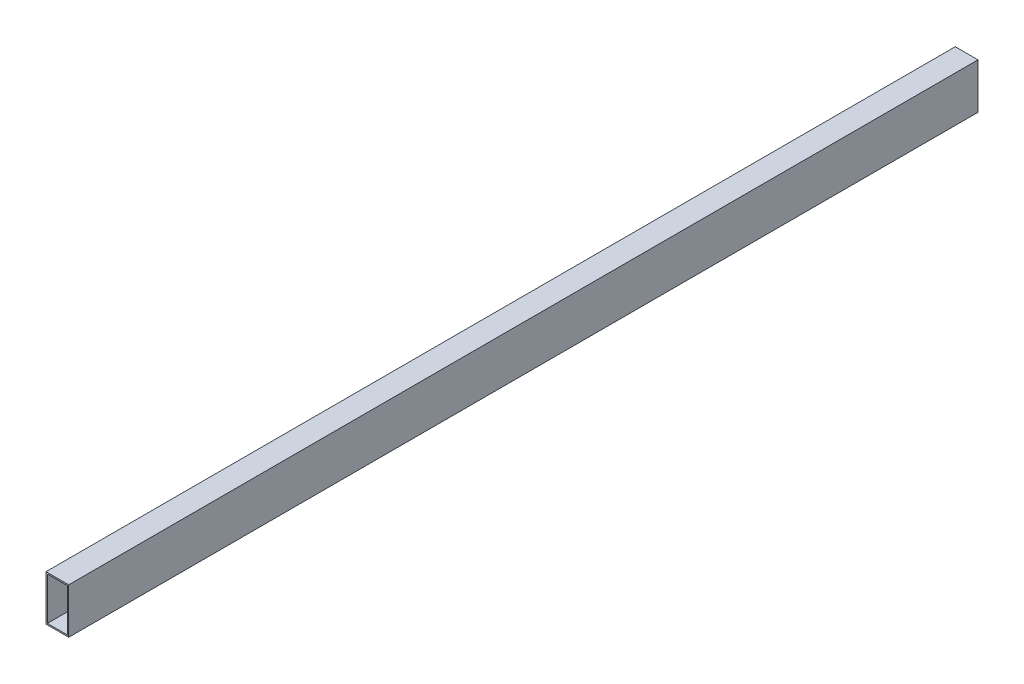
ISO-10303-21;
HEADER;
FILE_DESCRIPTION(('STEP AP214'),'2;1');
FILE_NAME('part.step','',(''),(''),'','','');
FILE_SCHEMA(('AUTOMOTIVE_DESIGN { 1 0 10303 214 1 1 1 1 }'));
ENDSEC;
DATA;
#1=APPLICATION_CONTEXT('core data for automotive mechanical design processes');
#2=APPLICATION_PROTOCOL_DEFINITION('international standard','automotive_design',2000,#1);
#3=PRODUCT_CONTEXT('',#1,'mechanical');
#4=PRODUCT('Part','Part','',(#3));
#5=PRODUCT_RELATED_PRODUCT_CATEGORY('part','',(#4));
#6=PRODUCT_DEFINITION_FORMATION('','',#4);
#7=PRODUCT_DEFINITION_CONTEXT('part definition',#1,'design');
#8=PRODUCT_DEFINITION('design','',#6,#7);
#9=PRODUCT_DEFINITION_SHAPE('','',#8);
#10=(LENGTH_UNIT() NAMED_UNIT(*) SI_UNIT(.MILLI.,.METRE.));
#11=(NAMED_UNIT(*) PLANE_ANGLE_UNIT() SI_UNIT($,.RADIAN.));
#12=(NAMED_UNIT(*) SI_UNIT($,.STERADIAN.) SOLID_ANGLE_UNIT());
#13=UNCERTAINTY_MEASURE_WITH_UNIT(LENGTH_MEASURE(1.E-05),#10,'distance_accuracy_value','');
#14=(GEOMETRIC_REPRESENTATION_CONTEXT(3) GLOBAL_UNCERTAINTY_ASSIGNED_CONTEXT((#13)) GLOBAL_UNIT_ASSIGNED_CONTEXT((#10,
#11,#12)) REPRESENTATION_CONTEXT('',''));
#15=CARTESIAN_POINT('',(0.,0.,0.));
#16=DIRECTION('',(0.,0.,1.));
#17=DIRECTION('',(1.,0.,0.));
#18=AXIS2_PLACEMENT_3D('',#15,#16,#17);
#19=CARTESIAN_POINT('',(0.,0.,1016.));
#20=DIRECTION('',(0.,0.,1.));
#21=DIRECTION('',(1.,0.,0.));
#22=AXIS2_PLACEMENT_3D('',#19,#20,#21);
#23=PLANE('',#22);
#24=DIRECTION('',(0.,-1.,0.));
#25=VECTOR('',#24,1.);
#26=CARTESIAN_POINT('',(0.,0.,1016.));
#27=LINE('',#26,#25);
#28=CARTESIAN_POINT('',(0.,50.8,1016.));
#29=VERTEX_POINT('',#28);
#30=CARTESIAN_POINT('',(0.,0.,1016.));
#31=VERTEX_POINT('',#30);
#32=EDGE_CURVE('E177',#29,#31,#27,.T.);
#33=ORIENTED_EDGE('',*,*,#32,.T.);
#34=DIRECTION('',(1.,0.,0.));
#35=VECTOR('',#34,1.);
#36=CARTESIAN_POINT('',(0.,0.,1016.));
#37=LINE('',#36,#35);
#38=CARTESIAN_POINT('',(25.4,0.,1016.));
#39=VERTEX_POINT('',#38);
#40=EDGE_CURVE('E181',#31,#39,#37,.T.);
#41=ORIENTED_EDGE('',*,*,#40,.T.);
#42=DIRECTION('',(0.,1.,0.));
#43=VECTOR('',#42,1.);
#44=CARTESIAN_POINT('',(25.4,0.,1016.));
#45=LINE('',#44,#43);
#46=CARTESIAN_POINT('',(25.4,50.8,1016.));
#47=VERTEX_POINT('',#46);
#48=EDGE_CURVE('E185',#39,#47,#45,.T.);
#49=ORIENTED_EDGE('',*,*,#48,.T.);
#50=DIRECTION('',(-1.,0.,0.));
#51=VECTOR('',#50,1.);
#52=CARTESIAN_POINT('',(0.,50.8,1016.));
#53=LINE('',#52,#51);
#54=EDGE_CURVE('E188',#47,#29,#53,.T.);
#55=ORIENTED_EDGE('',*,*,#54,.T.);
#56=EDGE_LOOP('',(#33,#41,#49,#55));
#57=FACE_BOUND('',#56,.T.);
#58=DIRECTION('',(1.,0.,0.));
#59=VECTOR('',#58,1.);
#60=CARTESIAN_POINT('',(0.,1.524,1016.));
#61=LINE('',#60,#59);
#62=CARTESIAN_POINT('',(1.524,1.524,1016.));
#63=VERTEX_POINT('',#62);
#64=CARTESIAN_POINT('',(23.876,1.524,1016.));
#65=VERTEX_POINT('',#64);
#66=EDGE_CURVE('E138',#63,#65,#61,.T.);
#67=ORIENTED_EDGE('',*,*,#66,.F.);
#68=DIRECTION('',(0.,-1.,0.));
#69=VECTOR('',#68,1.);
#70=CARTESIAN_POINT('',(1.524,0.,1016.));
#71=LINE('',#70,#69);
#72=CARTESIAN_POINT('',(1.52399999999999,49.276,1016.));
#73=VERTEX_POINT('',#72);
#74=EDGE_CURVE('E129',#73,#63,#71,.T.);
#75=ORIENTED_EDGE('',*,*,#74,.F.);
#76=DIRECTION('',(-1.,0.,0.));
#77=VECTOR('',#76,1.);
#78=CARTESIAN_POINT('',(0.,49.276,1016.));
#79=LINE('',#78,#77);
#80=CARTESIAN_POINT('',(23.876,49.276,1016.));
#81=VERTEX_POINT('',#80);
#82=EDGE_CURVE('E155',#81,#73,#79,.T.);
#83=ORIENTED_EDGE('',*,*,#82,.F.);
#84=DIRECTION('',(0.,1.,0.));
#85=VECTOR('',#84,1.);
#86=CARTESIAN_POINT('',(23.876,0.,1016.));
#87=LINE('',#86,#85);
#88=EDGE_CURVE('E151',#65,#81,#87,.T.);
#89=ORIENTED_EDGE('',*,*,#88,.F.);
#90=EDGE_LOOP('',(#67,#75,#83,#89));
#91=FACE_BOUND('',#90,.T.);
#92=ADVANCED_FACE('F63',(#57,#91),#23,.T.);
#93=CARTESIAN_POINT('',(0.,0.,0.));
#94=DIRECTION('',(0.,0.,1.));
#95=DIRECTION('',(1.,0.,0.));
#96=AXIS2_PLACEMENT_3D('',#93,#94,#95);
#97=PLANE('',#96);
#98=DIRECTION('',(0.,-1.,0.));
#99=VECTOR('',#98,1.);
#100=CARTESIAN_POINT('',(0.,0.,0.));
#101=LINE('',#100,#99);
#102=CARTESIAN_POINT('',(0.,50.8,0.));
#103=VERTEX_POINT('',#102);
#104=CARTESIAN_POINT('',(0.,0.,0.));
#105=VERTEX_POINT('',#104);
#106=EDGE_CURVE('E147',#103,#105,#101,.T.);
#107=ORIENTED_EDGE('',*,*,#106,.F.);
#108=DIRECTION('',(-1.,0.,0.));
#109=VECTOR('',#108,1.);
#110=CARTESIAN_POINT('',(0.,50.8,0.));
#111=LINE('',#110,#109);
#112=CARTESIAN_POINT('',(25.4,50.8,0.));
#113=VERTEX_POINT('',#112);
#114=EDGE_CURVE('E182',#113,#103,#111,.T.);
#115=ORIENTED_EDGE('',*,*,#114,.F.);
#116=DIRECTION('',(0.,1.,0.));
#117=VECTOR('',#116,1.);
#118=CARTESIAN_POINT('',(25.4,0.,0.));
#119=LINE('',#118,#117);
#120=CARTESIAN_POINT('',(25.4,0.,0.));
#121=VERTEX_POINT('',#120);
#122=EDGE_CURVE('E198',#121,#113,#119,.T.);
#123=ORIENTED_EDGE('',*,*,#122,.F.);
#124=DIRECTION('',(1.,0.,0.));
#125=VECTOR('',#124,1.);
#126=CARTESIAN_POINT('',(0.,0.,0.));
#127=LINE('',#126,#125);
#128=EDGE_CURVE('E195',#105,#121,#127,.T.);
#129=ORIENTED_EDGE('',*,*,#128,.F.);
#130=EDGE_LOOP('',(#107,#115,#123,#129));
#131=FACE_BOUND('',#130,.T.);
#132=DIRECTION('',(0.,-1.,0.));
#133=VECTOR('',#132,1.);
#134=CARTESIAN_POINT('',(1.524,0.,0.));
#135=LINE('',#134,#133);
#136=CARTESIAN_POINT('',(1.52399999999999,49.276,0.));
#137=VERTEX_POINT('',#136);
#138=CARTESIAN_POINT('',(1.524,1.524,0.));
#139=VERTEX_POINT('',#138);
#140=EDGE_CURVE('E87',#137,#139,#135,.T.);
#141=ORIENTED_EDGE('',*,*,#140,.T.);
#142=DIRECTION('',(1.,0.,0.));
#143=VECTOR('',#142,1.);
#144=CARTESIAN_POINT('',(0.,1.524,0.));
#145=LINE('',#144,#143);
#146=CARTESIAN_POINT('',(23.876,1.524,0.));
#147=VERTEX_POINT('',#146);
#148=EDGE_CURVE('E145',#139,#147,#145,.T.);
#149=ORIENTED_EDGE('',*,*,#148,.T.);
#150=DIRECTION('',(0.,1.,0.));
#151=VECTOR('',#150,1.);
#152=CARTESIAN_POINT('',(23.876,0.,0.));
#153=LINE('',#152,#151);
#154=CARTESIAN_POINT('',(23.876,49.276,0.));
#155=VERTEX_POINT('',#154);
#156=EDGE_CURVE('E164',#147,#155,#153,.T.);
#157=ORIENTED_EDGE('',*,*,#156,.T.);
#158=DIRECTION('',(-1.,0.,0.));
#159=VECTOR('',#158,1.);
#160=CARTESIAN_POINT('',(0.,49.276,0.));
#161=LINE('',#160,#159);
#162=EDGE_CURVE('E139',#155,#137,#161,.T.);
#163=ORIENTED_EDGE('',*,*,#162,.T.);
#164=EDGE_LOOP('',(#141,#149,#157,#163));
#165=FACE_BOUND('',#164,.T.);
#166=ADVANCED_FACE('F221',(#131,#165),#97,.F.);
#167=CARTESIAN_POINT('',(0.,0.,1016.));
#168=DIRECTION('',(1.,0.,0.));
#169=DIRECTION('',(0.,1.,0.));
#170=AXIS2_PLACEMENT_3D('',#167,#168,#169);
#171=PLANE('',#170);
#172=ORIENTED_EDGE('',*,*,#106,.T.);
#173=DIRECTION('',(0.,0.,-1.));
#174=VECTOR('',#173,1.);
#175=CARTESIAN_POINT('',(0.,0.,1016.));
#176=LINE('',#175,#174);
#177=EDGE_CURVE('E12',#31,#105,#176,.T.);
#178=ORIENTED_EDGE('',*,*,#177,.F.);
#179=ORIENTED_EDGE('',*,*,#32,.F.);
#180=DIRECTION('',(0.,0.,-1.));
#181=VECTOR('',#180,1.);
#182=CARTESIAN_POINT('',(0.,50.8,1016.));
#183=LINE('',#182,#181);
#184=EDGE_CURVE('E191',#29,#103,#183,.T.);
#185=ORIENTED_EDGE('',*,*,#184,.T.);
#186=EDGE_LOOP('',(#172,#178,#179,#185));
#187=FACE_BOUND('',#186,.T.);
#188=ADVANCED_FACE('F65',(#187),#171,.F.);
#189=CARTESIAN_POINT('',(0.,0.,1016.));
#190=DIRECTION('',(0.,1.,0.));
#191=DIRECTION('',(0.,0.,1.));
#192=AXIS2_PLACEMENT_3D('',#189,#190,#191);
#193=PLANE('',#192);
#194=ORIENTED_EDGE('',*,*,#128,.T.);
#195=DIRECTION('',(0.,0.,-1.));
#196=VECTOR('',#195,1.);
#197=CARTESIAN_POINT('',(25.4,0.,1016.));
#198=LINE('',#197,#196);
#199=EDGE_CURVE('E72',#39,#121,#198,.T.);
#200=ORIENTED_EDGE('',*,*,#199,.F.);
#201=ORIENTED_EDGE('',*,*,#40,.F.);
#202=ORIENTED_EDGE('',*,*,#177,.T.);
#203=EDGE_LOOP('',(#194,#200,#201,#202));
#204=FACE_BOUND('',#203,.T.);
#205=ADVANCED_FACE('F231',(#204),#193,.F.);
#206=CARTESIAN_POINT('',(25.4,0.,1016.));
#207=DIRECTION('',(-1.,0.,0.));
#208=DIRECTION('',(0.,-1.,0.));
#209=AXIS2_PLACEMENT_3D('',#206,#207,#208);
#210=PLANE('',#209);
#211=ORIENTED_EDGE('',*,*,#122,.T.);
#212=DIRECTION('',(0.,0.,-1.));
#213=VECTOR('',#212,1.);
#214=CARTESIAN_POINT('',(25.4,50.8,1016.));
#215=LINE('',#214,#213);
#216=EDGE_CURVE('E206',#47,#113,#215,.T.);
#217=ORIENTED_EDGE('',*,*,#216,.F.);
#218=ORIENTED_EDGE('',*,*,#48,.F.);
#219=ORIENTED_EDGE('',*,*,#199,.T.);
#220=EDGE_LOOP('',(#211,#217,#218,#219));
#221=FACE_BOUND('',#220,.T.);
#222=ADVANCED_FACE('F215',(#221),#210,.F.);
#223=CARTESIAN_POINT('',(0.,50.8,1016.));
#224=DIRECTION('',(0.,-1.,0.));
#225=DIRECTION('',(0.,0.,-1.));
#226=AXIS2_PLACEMENT_3D('',#223,#224,#225);
#227=PLANE('',#226);
#228=ORIENTED_EDGE('',*,*,#114,.T.);
#229=ORIENTED_EDGE('',*,*,#184,.F.);
#230=ORIENTED_EDGE('',*,*,#54,.F.);
#231=ORIENTED_EDGE('',*,*,#216,.T.);
#232=EDGE_LOOP('',(#228,#229,#230,#231));
#233=FACE_BOUND('',#232,.T.);
#234=ADVANCED_FACE('F225',(#233),#227,.F.);
#235=CARTESIAN_POINT('',(1.524,0.,1016.));
#236=DIRECTION('',(1.,0.,0.));
#237=DIRECTION('',(0.,1.,0.));
#238=AXIS2_PLACEMENT_3D('',#235,#236,#237);
#239=PLANE('',#238);
#240=ORIENTED_EDGE('',*,*,#140,.F.);
#241=DIRECTION('',(0.,0.,-1.));
#242=VECTOR('',#241,1.);
#243=CARTESIAN_POINT('',(1.52399999999999,49.276,1016.));
#244=LINE('',#243,#242);
#245=EDGE_CURVE('E133',#73,#137,#244,.T.);
#246=ORIENTED_EDGE('',*,*,#245,.F.);
#247=ORIENTED_EDGE('',*,*,#74,.T.);
#248=DIRECTION('',(0.,0.,-1.));
#249=VECTOR('',#248,1.);
#250=CARTESIAN_POINT('',(1.524,1.524,1016.));
#251=LINE('',#250,#249);
#252=EDGE_CURVE('E132',#63,#139,#251,.T.);
#253=ORIENTED_EDGE('',*,*,#252,.T.);
#254=EDGE_LOOP('',(#240,#246,#247,#253));
#255=FACE_BOUND('',#254,.T.);
#256=ADVANCED_FACE('F131',(#255),#239,.T.);
#257=CARTESIAN_POINT('',(0.,1.524,1016.));
#258=DIRECTION('',(0.,1.,0.));
#259=DIRECTION('',(0.,0.,1.));
#260=AXIS2_PLACEMENT_3D('',#257,#258,#259);
#261=PLANE('',#260);
#262=ORIENTED_EDGE('',*,*,#148,.F.);
#263=ORIENTED_EDGE('',*,*,#252,.F.);
#264=ORIENTED_EDGE('',*,*,#66,.T.);
#265=DIRECTION('',(0.,0.,-1.));
#266=VECTOR('',#265,1.);
#267=CARTESIAN_POINT('',(23.876,1.524,1016.));
#268=LINE('',#267,#266);
#269=EDGE_CURVE('E148',#65,#147,#268,.T.);
#270=ORIENTED_EDGE('',*,*,#269,.T.);
#271=EDGE_LOOP('',(#262,#263,#264,#270));
#272=FACE_BOUND('',#271,.T.);
#273=ADVANCED_FACE('F142',(#272),#261,.T.);
#274=CARTESIAN_POINT('',(23.876,0.,1016.));
#275=DIRECTION('',(-1.,0.,0.));
#276=DIRECTION('',(0.,-1.,0.));
#277=AXIS2_PLACEMENT_3D('',#274,#275,#276);
#278=PLANE('',#277);
#279=ORIENTED_EDGE('',*,*,#156,.F.);
#280=ORIENTED_EDGE('',*,*,#269,.F.);
#281=ORIENTED_EDGE('',*,*,#88,.T.);
#282=DIRECTION('',(0.,0.,-1.));
#283=VECTOR('',#282,1.);
#284=CARTESIAN_POINT('',(23.876,49.276,1016.));
#285=LINE('',#284,#283);
#286=EDGE_CURVE('E79',#81,#155,#285,.T.);
#287=ORIENTED_EDGE('',*,*,#286,.T.);
#288=EDGE_LOOP('',(#279,#280,#281,#287));
#289=FACE_BOUND('',#288,.T.);
#290=ADVANCED_FACE('F254',(#289),#278,.T.);
#291=CARTESIAN_POINT('',(0.,49.276,1016.));
#292=DIRECTION('',(0.,-1.,0.));
#293=DIRECTION('',(0.,0.,-1.));
#294=AXIS2_PLACEMENT_3D('',#291,#292,#293);
#295=PLANE('',#294);
#296=ORIENTED_EDGE('',*,*,#162,.F.);
#297=ORIENTED_EDGE('',*,*,#286,.F.);
#298=ORIENTED_EDGE('',*,*,#82,.T.);
#299=ORIENTED_EDGE('',*,*,#245,.T.);
#300=EDGE_LOOP('',(#296,#297,#298,#299));
#301=FACE_BOUND('',#300,.T.);
#302=ADVANCED_FACE('F258',(#301),#295,.T.);
#303=CLOSED_SHELL('',(#92,#166,#188,#205,#222,#234,#256,#273,#290,#302));
#304=MANIFOLD_SOLID_BREP('B2',#303);
#305=ADVANCED_BREP_SHAPE_REPRESENTATION('',(#18,#304),#14);
#306=SHAPE_DEFINITION_REPRESENTATION(#9,#305);
ENDSEC;
END-ISO-10303-21;
